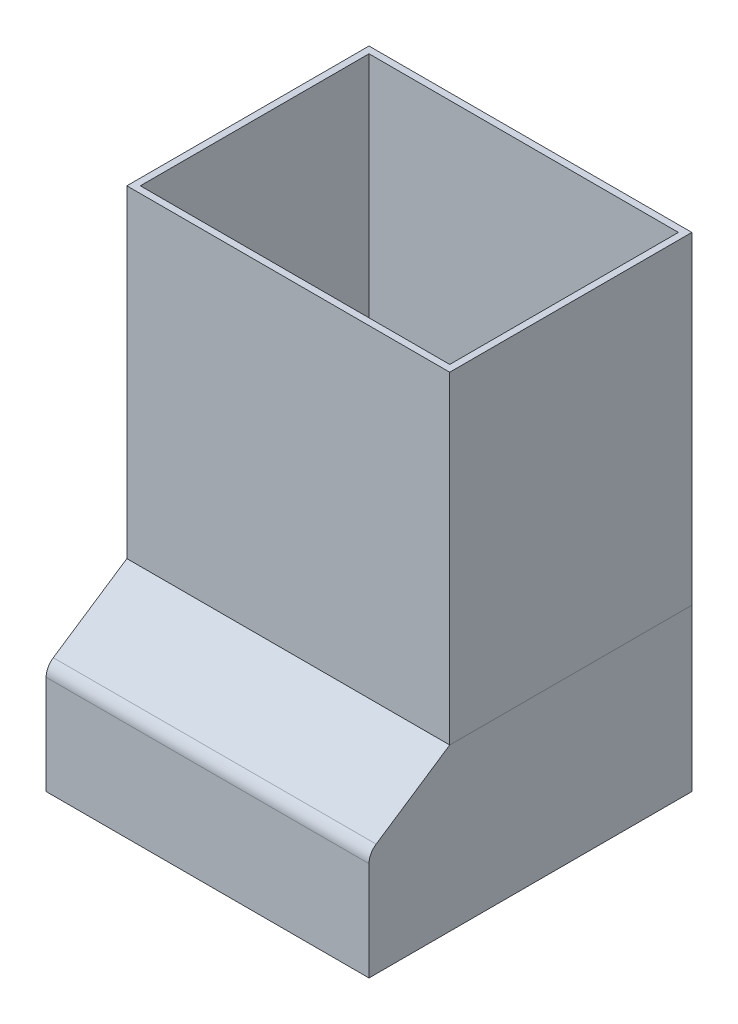
ISO-10303-21;
HEADER;
FILE_DESCRIPTION(('STEP AP214'),'2;1');
FILE_NAME('part.step','',(''),(''),'','','');
FILE_SCHEMA(('AUTOMOTIVE_DESIGN { 1 0 10303 214 1 1 1 1 }'));
ENDSEC;
DATA;
#1=APPLICATION_CONTEXT('core data for automotive mechanical design processes');
#2=APPLICATION_PROTOCOL_DEFINITION('international standard','automotive_design',2000,#1);
#3=PRODUCT_CONTEXT('',#1,'mechanical');
#4=PRODUCT('Part','Part','',(#3));
#5=PRODUCT_RELATED_PRODUCT_CATEGORY('part','',(#4));
#6=PRODUCT_DEFINITION_FORMATION('','',#4);
#7=PRODUCT_DEFINITION_CONTEXT('part definition',#1,'design');
#8=PRODUCT_DEFINITION('design','',#6,#7);
#9=PRODUCT_DEFINITION_SHAPE('','',#8);
#10=(LENGTH_UNIT() NAMED_UNIT(*) SI_UNIT(.MILLI.,.METRE.));
#11=(NAMED_UNIT(*) PLANE_ANGLE_UNIT() SI_UNIT($,.RADIAN.));
#12=(NAMED_UNIT(*) SI_UNIT($,.STERADIAN.) SOLID_ANGLE_UNIT());
#13=UNCERTAINTY_MEASURE_WITH_UNIT(LENGTH_MEASURE(1.E-05),#10,'distance_accuracy_value','');
#14=(GEOMETRIC_REPRESENTATION_CONTEXT(3) GLOBAL_UNCERTAINTY_ASSIGNED_CONTEXT((#13)) GLOBAL_UNIT_ASSIGNED_CONTEXT((#10,
#11,#12)) REPRESENTATION_CONTEXT('',''));
#15=CARTESIAN_POINT('',(0.,0.,0.));
#16=DIRECTION('',(0.,0.,1.));
#17=DIRECTION('',(1.,0.,0.));
#18=AXIS2_PLACEMENT_3D('',#15,#16,#17);
#19=CARTESIAN_POINT('',(0.,469.9,0.));
#20=DIRECTION('',(0.,-1.,0.));
#21=DIRECTION('',(0.,0.,-1.));
#22=AXIS2_PLACEMENT_3D('',#19,#20,#21);
#23=PLANE('',#22);
#24=DIRECTION('',(0.,0.,-1.));
#25=VECTOR('',#24,1.);
#26=CARTESIAN_POINT('',(-177.8,469.9,0.));
#27=LINE('',#26,#25);
#28=CARTESIAN_POINT('',(-177.8,469.9,139.7));
#29=VERTEX_POINT('',#28);
#30=CARTESIAN_POINT('',(-177.8,469.9,50.8));
#31=VERTEX_POINT('',#30);
#32=EDGE_CURVE('E177',#29,#31,#27,.T.);
#33=ORIENTED_EDGE('',*,*,#32,.F.);
#34=DIRECTION('',(1.,0.,0.));
#35=VECTOR('',#34,1.);
#36=CARTESIAN_POINT('',(-165.1,469.9,139.7));
#37=LINE('',#36,#35);
#38=CARTESIAN_POINT('',(-165.1,469.9,139.7));
#39=VERTEX_POINT('',#38);
#40=EDGE_CURVE('E193',#29,#39,#37,.T.);
#41=ORIENTED_EDGE('',*,*,#40,.T.);
#42=DIRECTION('',(0.,0.,-1.));
#43=VECTOR('',#42,1.);
#44=CARTESIAN_POINT('',(-165.1,469.9,38.1));
#45=LINE('',#44,#43);
#46=CARTESIAN_POINT('',(-165.1,469.9,38.1));
#47=VERTEX_POINT('',#46);
#48=EDGE_CURVE('E196',#39,#47,#45,.T.);
#49=ORIENTED_EDGE('',*,*,#48,.T.);
#50=DIRECTION('',(-1.,0.,0.));
#51=VECTOR('',#50,1.);
#52=CARTESIAN_POINT('',(-292.1,469.9,38.1));
#53=LINE('',#52,#51);
#54=CARTESIAN_POINT('',(-292.1,469.9,38.1));
#55=VERTEX_POINT('',#54);
#56=EDGE_CURVE('E198',#47,#55,#53,.T.);
#57=ORIENTED_EDGE('',*,*,#56,.T.);
#58=DIRECTION('',(0.,0.,1.));
#59=VECTOR('',#58,1.);
#60=CARTESIAN_POINT('',(-292.1,469.9,139.7));
#61=LINE('',#60,#59);
#62=CARTESIAN_POINT('',(-292.1,469.9,50.8));
#63=VERTEX_POINT('',#62);
#64=EDGE_CURVE('E190',#55,#63,#61,.T.);
#65=ORIENTED_EDGE('',*,*,#64,.T.);
#66=DIRECTION('',(-1.,0.,0.));
#67=VECTOR('',#66,1.);
#68=CARTESIAN_POINT('',(0.,469.9,50.8));
#69=LINE('',#68,#67);
#70=EDGE_CURVE('E71',#31,#63,#69,.T.);
#71=ORIENTED_EDGE('',*,*,#70,.F.);
#72=EDGE_LOOP('',(#33,#41,#49,#57,#65,#71));
#73=FACE_BOUND('',#72,.T.);
#74=ADVANCED_FACE('F48',(#73),#23,.F.);
#75=CARTESIAN_POINT('',(-292.1,914.4,-304.8));
#76=DIRECTION('',(1.,0.,0.));
#77=DIRECTION('',(0.,0.,-1.));
#78=AXIS2_PLACEMENT_3D('',#75,#76,#77);
#79=PLANE('',#78);
#80=ORIENTED_EDGE('',*,*,#64,.F.);
#81=DIRECTION('',(0.,-1.,0.));
#82=VECTOR('',#81,1.);
#83=CARTESIAN_POINT('',(-292.1,469.9,38.1));
#84=LINE('',#83,#82);
#85=CARTESIAN_POINT('',(-292.1,317.5,38.1));
#86=VERTEX_POINT('',#85);
#87=EDGE_CURVE('E200',#55,#86,#84,.T.);
#88=ORIENTED_EDGE('',*,*,#87,.T.);
#89=DIRECTION('',(0.,0.,1.));
#90=VECTOR('',#89,1.);
#91=CARTESIAN_POINT('',(-292.1,317.5,-304.8));
#92=LINE('',#91,#90);
#93=CARTESIAN_POINT('',(-292.1,317.5,-292.1));
#94=VERTEX_POINT('',#93);
#95=EDGE_CURVE('E213',#94,#86,#92,.T.);
#96=ORIENTED_EDGE('',*,*,#95,.F.);
#97=DIRECTION('',(0.,-1.,0.));
#98=VECTOR('',#97,1.);
#99=CARTESIAN_POINT('',(-292.1,914.4,-292.1));
#100=LINE('',#99,#98);
#101=CARTESIAN_POINT('',(-292.1,914.4,-292.1));
#102=VERTEX_POINT('',#101);
#103=EDGE_CURVE('E162',#102,#94,#100,.T.);
#104=ORIENTED_EDGE('',*,*,#103,.F.);
#105=DIRECTION('',(0.,0.,1.));
#106=VECTOR('',#105,1.);
#107=CARTESIAN_POINT('',(-292.1,914.4,-304.8));
#108=LINE('',#107,#106);
#109=CARTESIAN_POINT('',(-292.1,914.4,139.7));
#110=VERTEX_POINT('',#109);
#111=EDGE_CURVE('E159',#102,#110,#108,.T.);
#112=ORIENTED_EDGE('',*,*,#111,.T.);
#113=DIRECTION('',(0.,-1.,0.));
#114=VECTOR('',#113,1.);
#115=CARTESIAN_POINT('',(-292.1,914.4,139.7));
#116=LINE('',#115,#114);
#117=CARTESIAN_POINT('',(-292.1,304.8,139.7));
#118=VERTEX_POINT('',#117);
#119=EDGE_CURVE('E151',#110,#118,#116,.T.);
#120=ORIENTED_EDGE('',*,*,#119,.T.);
#121=DIRECTION('',(0.,0.,1.));
#122=VECTOR('',#121,1.);
#123=CARTESIAN_POINT('',(-292.1,304.8,0.));
#124=LINE('',#123,#122);
#125=CARTESIAN_POINT('',(-292.1,304.8,50.8));
#126=VERTEX_POINT('',#125);
#127=EDGE_CURVE('E155',#126,#118,#124,.T.);
#128=ORIENTED_EDGE('',*,*,#127,.F.);
#129=DIRECTION('',(0.,-1.,0.));
#130=VECTOR('',#129,1.);
#131=CARTESIAN_POINT('',(-292.1,914.4,50.8));
#132=LINE('',#131,#130);
#133=EDGE_CURVE('E184',#63,#126,#132,.T.);
#134=ORIENTED_EDGE('',*,*,#133,.F.);
#135=EDGE_LOOP('',(#80,#88,#96,#104,#112,#120,#128,#134));
#136=FACE_BOUND('',#135,.T.);
#137=ADVANCED_FACE('F153',(#136),#79,.T.);
#138=CARTESIAN_POINT('',(-304.8,914.4,139.7));
#139=DIRECTION('',(0.,0.,-1.));
#140=DIRECTION('',(-1.,0.,0.));
#141=AXIS2_PLACEMENT_3D('',#138,#139,#140);
#142=PLANE('',#141);
#143=DIRECTION('',(1.,0.,0.));
#144=VECTOR('',#143,1.);
#145=CARTESIAN_POINT('',(-304.8,317.5,139.7));
#146=LINE('',#145,#144);
#147=CARTESIAN_POINT('',(-165.1,317.5,139.7));
#148=VERTEX_POINT('',#147);
#149=CARTESIAN_POINT('',(292.1,317.5,139.7));
#150=VERTEX_POINT('',#149);
#151=EDGE_CURVE('E222',#148,#150,#146,.T.);
#152=ORIENTED_EDGE('',*,*,#151,.F.);
#153=DIRECTION('',(0.,-1.,0.));
#154=VECTOR('',#153,1.);
#155=CARTESIAN_POINT('',(-165.1,469.9,139.7));
#156=LINE('',#155,#154);
#157=EDGE_CURVE('E208',#39,#148,#156,.T.);
#158=ORIENTED_EDGE('',*,*,#157,.F.);
#159=ORIENTED_EDGE('',*,*,#40,.F.);
#160=DIRECTION('',(0.,1.,0.));
#161=VECTOR('',#160,1.);
#162=CARTESIAN_POINT('',(-177.8,914.4,139.7));
#163=LINE('',#162,#161);
#164=CARTESIAN_POINT('',(-177.8,304.8,139.7));
#165=VERTEX_POINT('',#164);
#166=EDGE_CURVE('E63',#165,#29,#163,.T.);
#167=ORIENTED_EDGE('',*,*,#166,.F.);
#168=DIRECTION('',(1.,0.,0.));
#169=VECTOR('',#168,1.);
#170=CARTESIAN_POINT('',(0.,304.8,139.7));
#171=LINE('',#170,#169);
#172=EDGE_CURVE('E166',#118,#165,#171,.T.);
#173=ORIENTED_EDGE('',*,*,#172,.F.);
#174=ORIENTED_EDGE('',*,*,#119,.F.);
#175=DIRECTION('',(1.,0.,0.));
#176=VECTOR('',#175,1.);
#177=CARTESIAN_POINT('',(-304.8,914.4,139.7));
#178=LINE('',#177,#176);
#179=CARTESIAN_POINT('',(292.1,914.4,139.7));
#180=VERTEX_POINT('',#179);
#181=EDGE_CURVE('E232',#110,#180,#178,.T.);
#182=ORIENTED_EDGE('',*,*,#181,.T.);
#183=DIRECTION('',(0.,-1.,0.));
#184=VECTOR('',#183,1.);
#185=CARTESIAN_POINT('',(292.1,914.4,139.7));
#186=LINE('',#185,#184);
#187=EDGE_CURVE('E163',#180,#150,#186,.T.);
#188=ORIENTED_EDGE('',*,*,#187,.T.);
#189=EDGE_LOOP('',(#152,#158,#159,#167,#173,#174,#182,#188));
#190=FACE_BOUND('',#189,.T.);
#191=ADVANCED_FACE('F168',(#190),#142,.T.);
#192=CARTESIAN_POINT('',(0.,317.5,0.));
#193=DIRECTION('',(0.,1.,0.));
#194=DIRECTION('',(0.,0.,1.));
#195=AXIS2_PLACEMENT_3D('',#192,#193,#194);
#196=PLANE('',#195);
#197=DIRECTION('',(-1.,0.,0.));
#198=VECTOR('',#197,1.);
#199=CARTESIAN_POINT('',(-292.1,317.5,38.1));
#200=LINE('',#199,#198);
#201=CARTESIAN_POINT('',(-165.1,317.5,38.1));
#202=VERTEX_POINT('',#201);
#203=EDGE_CURVE('E194',#202,#86,#200,.T.);
#204=ORIENTED_EDGE('',*,*,#203,.F.);
#205=DIRECTION('',(0.,0.,-1.));
#206=VECTOR('',#205,1.);
#207=CARTESIAN_POINT('',(-165.1,317.5,38.1));
#208=LINE('',#207,#206);
#209=EDGE_CURVE('E189',#148,#202,#208,.T.);
#210=ORIENTED_EDGE('',*,*,#209,.F.);
#211=ORIENTED_EDGE('',*,*,#151,.T.);
#212=DIRECTION('',(0.,0.,-1.));
#213=VECTOR('',#212,1.);
#214=CARTESIAN_POINT('',(292.1,317.5,152.4));
#215=LINE('',#214,#213);
#216=CARTESIAN_POINT('',(292.1,317.5,-292.1));
#217=VERTEX_POINT('',#216);
#218=EDGE_CURVE('E225',#150,#217,#215,.T.);
#219=ORIENTED_EDGE('',*,*,#218,.T.);
#220=DIRECTION('',(-1.,0.,0.));
#221=VECTOR('',#220,1.);
#222=CARTESIAN_POINT('',(304.8,317.5,-292.1));
#223=LINE('',#222,#221);
#224=EDGE_CURVE('E210',#217,#94,#223,.T.);
#225=ORIENTED_EDGE('',*,*,#224,.T.);
#226=ORIENTED_EDGE('',*,*,#95,.T.);
#227=EDGE_LOOP('',(#204,#210,#211,#219,#225,#226));
#228=FACE_BOUND('',#227,.T.);
#229=ADVANCED_FACE('F283',(#228),#196,.T.);
#230=CARTESIAN_POINT('',(304.8,914.4,-304.8));
#231=DIRECTION('',(0.,0.,1.));
#232=DIRECTION('',(1.,0.,0.));
#233=AXIS2_PLACEMENT_3D('',#230,#231,#232);
#234=PLANE('',#233);
#235=DIRECTION('',(-1.,0.,0.));
#236=VECTOR('',#235,1.);
#237=CARTESIAN_POINT('',(304.8,304.8,-304.8));
#238=LINE('',#237,#236);
#239=CARTESIAN_POINT('',(304.8,304.8,-304.8));
#240=VERTEX_POINT('',#239);
#241=CARTESIAN_POINT('',(-304.8,304.8,-304.8));
#242=VERTEX_POINT('',#241);
#243=EDGE_CURVE('E216',#240,#242,#238,.T.);
#244=ORIENTED_EDGE('',*,*,#243,.T.);
#245=DIRECTION('',(0.,-1.,0.));
#246=VECTOR('',#245,1.);
#247=CARTESIAN_POINT('',(-304.8,914.4,-304.8));
#248=LINE('',#247,#246);
#249=CARTESIAN_POINT('',(-304.8,914.4,-304.8));
#250=VERTEX_POINT('',#249);
#251=EDGE_CURVE('E12',#250,#242,#248,.T.);
#252=ORIENTED_EDGE('',*,*,#251,.F.);
#253=DIRECTION('',(-1.,0.,0.));
#254=VECTOR('',#253,1.);
#255=CARTESIAN_POINT('',(304.8,914.4,-304.8));
#256=LINE('',#255,#254);
#257=CARTESIAN_POINT('',(304.8,914.4,-304.8));
#258=VERTEX_POINT('',#257);
#259=EDGE_CURVE('E235',#258,#250,#256,.T.);
#260=ORIENTED_EDGE('',*,*,#259,.F.);
#261=DIRECTION('',(0.,-1.,0.));
#262=VECTOR('',#261,1.);
#263=CARTESIAN_POINT('',(304.8,914.4,-304.8));
#264=LINE('',#263,#262);
#265=EDGE_CURVE('E245',#258,#240,#264,.T.);
#266=ORIENTED_EDGE('',*,*,#265,.T.);
#267=EDGE_LOOP('',(#244,#252,#260,#266));
#268=FACE_BOUND('',#267,.T.);
#269=ADVANCED_FACE('F50',(#268),#234,.F.);
#270=CARTESIAN_POINT('',(-304.8,914.4,-304.8));
#271=DIRECTION('',(1.,0.,0.));
#272=DIRECTION('',(0.,0.,-1.));
#273=AXIS2_PLACEMENT_3D('',#270,#271,#272);
#274=PLANE('',#273);
#275=DIRECTION('',(0.,0.,1.));
#276=VECTOR('',#275,1.);
#277=CARTESIAN_POINT('',(-304.8,304.8,-304.8));
#278=LINE('',#277,#276);
#279=CARTESIAN_POINT('',(-304.8,304.8,152.4));
#280=VERTEX_POINT('',#279);
#281=EDGE_CURVE('E248',#242,#280,#278,.T.);
#282=ORIENTED_EDGE('',*,*,#281,.T.);
#283=DIRECTION('',(0.,-1.,0.));
#284=VECTOR('',#283,1.);
#285=CARTESIAN_POINT('',(-304.8,914.4,152.4));
#286=LINE('',#285,#284);
#287=CARTESIAN_POINT('',(-304.8,914.4,152.4));
#288=VERTEX_POINT('',#287);
#289=EDGE_CURVE('E56',#288,#280,#286,.T.);
#290=ORIENTED_EDGE('',*,*,#289,.F.);
#291=DIRECTION('',(0.,0.,1.));
#292=VECTOR('',#291,1.);
#293=CARTESIAN_POINT('',(-304.8,914.4,-304.8));
#294=LINE('',#293,#292);
#295=EDGE_CURVE('E238',#250,#288,#294,.T.);
#296=ORIENTED_EDGE('',*,*,#295,.F.);
#297=ORIENTED_EDGE('',*,*,#251,.T.);
#298=EDGE_LOOP('',(#282,#290,#296,#297));
#299=FACE_BOUND('',#298,.T.);
#300=ADVANCED_FACE('F276',(#299),#274,.F.);
#301=CARTESIAN_POINT('',(-304.8,914.4,152.4));
#302=DIRECTION('',(0.,0.,-1.));
#303=DIRECTION('',(-1.,0.,0.));
#304=AXIS2_PLACEMENT_3D('',#301,#302,#303);
#305=PLANE('',#304);
#306=DIRECTION('',(1.,0.,0.));
#307=VECTOR('',#306,1.);
#308=CARTESIAN_POINT('',(-304.8,304.8,152.4));
#309=LINE('',#308,#307);
#310=CARTESIAN_POINT('',(304.8,304.8,152.4));
#311=VERTEX_POINT('',#310);
#312=EDGE_CURVE('E250',#280,#311,#309,.T.);
#313=ORIENTED_EDGE('',*,*,#312,.T.);
#314=DIRECTION('',(0.,-1.,0.));
#315=VECTOR('',#314,1.);
#316=CARTESIAN_POINT('',(304.8,914.4,152.4));
#317=LINE('',#316,#315);
#318=CARTESIAN_POINT('',(304.8,914.4,152.4));
#319=VERTEX_POINT('',#318);
#320=EDGE_CURVE('E255',#319,#311,#317,.T.);
#321=ORIENTED_EDGE('',*,*,#320,.F.);
#322=DIRECTION('',(1.,0.,0.));
#323=VECTOR('',#322,1.);
#324=CARTESIAN_POINT('',(-304.8,914.4,152.4));
#325=LINE('',#324,#323);
#326=EDGE_CURVE('E241',#288,#319,#325,.T.);
#327=ORIENTED_EDGE('',*,*,#326,.F.);
#328=ORIENTED_EDGE('',*,*,#289,.T.);
#329=EDGE_LOOP('',(#313,#321,#327,#328));
#330=FACE_BOUND('',#329,.T.);
#331=ADVANCED_FACE('F262',(#330),#305,.F.);
#332=CARTESIAN_POINT('',(304.8,914.4,152.4));
#333=DIRECTION('',(-1.,0.,0.));
#334=DIRECTION('',(0.,0.,1.));
#335=AXIS2_PLACEMENT_3D('',#332,#333,#334);
#336=PLANE('',#335);
#337=DIRECTION('',(0.,0.,-1.));
#338=VECTOR('',#337,1.);
#339=CARTESIAN_POINT('',(304.8,304.8,152.4));
#340=LINE('',#339,#338);
#341=EDGE_CURVE('E239',#311,#240,#340,.T.);
#342=ORIENTED_EDGE('',*,*,#341,.T.);
#343=ORIENTED_EDGE('',*,*,#265,.F.);
#344=DIRECTION('',(0.,0.,-1.));
#345=VECTOR('',#344,1.);
#346=CARTESIAN_POINT('',(304.8,914.4,152.4));
#347=LINE('',#346,#345);
#348=EDGE_CURVE('E243',#319,#258,#347,.T.);
#349=ORIENTED_EDGE('',*,*,#348,.F.);
#350=ORIENTED_EDGE('',*,*,#320,.T.);
#351=EDGE_LOOP('',(#342,#343,#349,#350));
#352=FACE_BOUND('',#351,.T.);
#353=ADVANCED_FACE('F269',(#352),#336,.F.);
#354=CARTESIAN_POINT('',(0.,914.4,0.));
#355=DIRECTION('',(0.,1.,0.));
#356=DIRECTION('',(0.,0.,1.));
#357=AXIS2_PLACEMENT_3D('',#354,#355,#356);
#358=PLANE('',#357);
#359=DIRECTION('',(-1.,0.,0.));
#360=VECTOR('',#359,1.);
#361=CARTESIAN_POINT('',(304.8,914.4,-292.1));
#362=LINE('',#361,#360);
#363=CARTESIAN_POINT('',(292.1,914.4,-292.1));
#364=VERTEX_POINT('',#363);
#365=EDGE_CURVE('E229',#364,#102,#362,.T.);
#366=ORIENTED_EDGE('',*,*,#365,.F.);
#367=DIRECTION('',(0.,0.,-1.));
#368=VECTOR('',#367,1.);
#369=CARTESIAN_POINT('',(292.1,914.4,152.4));
#370=LINE('',#369,#368);
#371=EDGE_CURVE('E220',#180,#364,#370,.T.);
#372=ORIENTED_EDGE('',*,*,#371,.F.);
#373=ORIENTED_EDGE('',*,*,#181,.F.);
#374=ORIENTED_EDGE('',*,*,#111,.F.);
#375=EDGE_LOOP('',(#366,#372,#373,#374));
#376=FACE_BOUND('',#375,.T.);
#377=ORIENTED_EDGE('',*,*,#259,.T.);
#378=ORIENTED_EDGE('',*,*,#295,.T.);
#379=ORIENTED_EDGE('',*,*,#326,.T.);
#380=ORIENTED_EDGE('',*,*,#348,.T.);
#381=EDGE_LOOP('',(#377,#378,#379,#380));
#382=FACE_BOUND('',#381,.T.);
#383=ADVANCED_FACE('F275',(#376,#382),#358,.T.);
#384=CARTESIAN_POINT('',(0.,304.8,0.));
#385=DIRECTION('',(0.,1.,0.));
#386=DIRECTION('',(0.,0.,1.));
#387=AXIS2_PLACEMENT_3D('',#384,#385,#386);
#388=PLANE('',#387);
#389=DIRECTION('',(-1.,0.,0.));
#390=VECTOR('',#389,1.);
#391=CARTESIAN_POINT('',(0.,304.8,50.8));
#392=LINE('',#391,#390);
#393=CARTESIAN_POINT('',(-177.8,304.8,50.8));
#394=VERTEX_POINT('',#393);
#395=EDGE_CURVE('E176',#394,#126,#392,.T.);
#396=ORIENTED_EDGE('',*,*,#395,.T.);
#397=ORIENTED_EDGE('',*,*,#127,.T.);
#398=ORIENTED_EDGE('',*,*,#172,.T.);
#399=DIRECTION('',(0.,0.,-1.));
#400=VECTOR('',#399,1.);
#401=CARTESIAN_POINT('',(-177.8,304.8,0.));
#402=LINE('',#401,#400);
#403=EDGE_CURVE('E171',#165,#394,#402,.T.);
#404=ORIENTED_EDGE('',*,*,#403,.T.);
#405=EDGE_LOOP('',(#396,#397,#398,#404));
#406=FACE_BOUND('',#405,.T.);
#407=ORIENTED_EDGE('',*,*,#243,.F.);
#408=ORIENTED_EDGE('',*,*,#341,.F.);
#409=ORIENTED_EDGE('',*,*,#312,.F.);
#410=ORIENTED_EDGE('',*,*,#281,.F.);
#411=EDGE_LOOP('',(#407,#408,#409,#410));
#412=FACE_BOUND('',#411,.T.);
#413=ADVANCED_FACE('F173',(#406,#412),#388,.F.);
#414=CARTESIAN_POINT('',(304.8,914.4,-292.1));
#415=DIRECTION('',(0.,0.,1.));
#416=DIRECTION('',(1.,0.,0.));
#417=AXIS2_PLACEMENT_3D('',#414,#415,#416);
#418=PLANE('',#417);
#419=ORIENTED_EDGE('',*,*,#224,.F.);
#420=DIRECTION('',(0.,-1.,0.));
#421=VECTOR('',#420,1.);
#422=CARTESIAN_POINT('',(292.1,914.4,-292.1));
#423=LINE('',#422,#421);
#424=EDGE_CURVE('E217',#364,#217,#423,.T.);
#425=ORIENTED_EDGE('',*,*,#424,.F.);
#426=ORIENTED_EDGE('',*,*,#365,.T.);
#427=ORIENTED_EDGE('',*,*,#103,.T.);
#428=EDGE_LOOP('',(#419,#425,#426,#427));
#429=FACE_BOUND('',#428,.T.);
#430=ADVANCED_FACE('F305',(#429),#418,.T.);
#431=CARTESIAN_POINT('',(292.1,914.4,152.4));
#432=DIRECTION('',(-1.,0.,0.));
#433=DIRECTION('',(0.,0.,1.));
#434=AXIS2_PLACEMENT_3D('',#431,#432,#433);
#435=PLANE('',#434);
#436=ORIENTED_EDGE('',*,*,#218,.F.);
#437=ORIENTED_EDGE('',*,*,#187,.F.);
#438=ORIENTED_EDGE('',*,*,#371,.T.);
#439=ORIENTED_EDGE('',*,*,#424,.T.);
#440=EDGE_LOOP('',(#436,#437,#438,#439));
#441=FACE_BOUND('',#440,.T.);
#442=ADVANCED_FACE('F303',(#441),#435,.T.);
#443=CARTESIAN_POINT('',(-165.1,469.9,38.1));
#444=DIRECTION('',(-1.,0.,0.));
#445=DIRECTION('',(0.,0.,1.));
#446=AXIS2_PLACEMENT_3D('',#443,#444,#445);
#447=PLANE('',#446);
#448=ORIENTED_EDGE('',*,*,#209,.T.);
#449=DIRECTION('',(0.,-1.,0.));
#450=VECTOR('',#449,1.);
#451=CARTESIAN_POINT('',(-165.1,469.9,38.1));
#452=LINE('',#451,#450);
#453=EDGE_CURVE('E206',#47,#202,#452,.T.);
#454=ORIENTED_EDGE('',*,*,#453,.F.);
#455=ORIENTED_EDGE('',*,*,#48,.F.);
#456=ORIENTED_EDGE('',*,*,#157,.T.);
#457=EDGE_LOOP('',(#448,#454,#455,#456));
#458=FACE_BOUND('',#457,.T.);
#459=ADVANCED_FACE('F299',(#458),#447,.F.);
#460=CARTESIAN_POINT('',(-292.1,469.9,38.1));
#461=DIRECTION('',(0.,0.,1.));
#462=DIRECTION('',(1.,0.,0.));
#463=AXIS2_PLACEMENT_3D('',#460,#461,#462);
#464=PLANE('',#463);
#465=ORIENTED_EDGE('',*,*,#203,.T.);
#466=ORIENTED_EDGE('',*,*,#87,.F.);
#467=ORIENTED_EDGE('',*,*,#56,.F.);
#468=ORIENTED_EDGE('',*,*,#453,.T.);
#469=EDGE_LOOP('',(#465,#466,#467,#468));
#470=FACE_BOUND('',#469,.T.);
#471=ADVANCED_FACE('F297',(#470),#464,.F.);
#472=CARTESIAN_POINT('',(-292.1,469.9,50.8));
#473=DIRECTION('',(0.,0.,1.));
#474=DIRECTION('',(1.,0.,0.));
#475=AXIS2_PLACEMENT_3D('',#472,#473,#474);
#476=PLANE('',#475);
#477=DIRECTION('',(0.,-1.,0.));
#478=VECTOR('',#477,1.);
#479=CARTESIAN_POINT('',(-177.8,469.9,50.8));
#480=LINE('',#479,#478);
#481=EDGE_CURVE('E183',#31,#394,#480,.T.);
#482=ORIENTED_EDGE('',*,*,#481,.F.);
#483=ORIENTED_EDGE('',*,*,#70,.T.);
#484=ORIENTED_EDGE('',*,*,#133,.T.);
#485=ORIENTED_EDGE('',*,*,#395,.F.);
#486=EDGE_LOOP('',(#482,#483,#484,#485));
#487=FACE_BOUND('',#486,.T.);
#488=ADVANCED_FACE('F295',(#487),#476,.T.);
#489=CARTESIAN_POINT('',(-177.8,469.9,38.1));
#490=DIRECTION('',(-1.,0.,0.));
#491=DIRECTION('',(0.,0.,1.));
#492=AXIS2_PLACEMENT_3D('',#489,#490,#491);
#493=PLANE('',#492);
#494=ORIENTED_EDGE('',*,*,#166,.T.);
#495=ORIENTED_EDGE('',*,*,#32,.T.);
#496=ORIENTED_EDGE('',*,*,#481,.T.);
#497=ORIENTED_EDGE('',*,*,#403,.F.);
#498=EDGE_LOOP('',(#494,#495,#496,#497));
#499=FACE_BOUND('',#498,.T.);
#500=ADVANCED_FACE('F363',(#499),#493,.T.);
#501=CLOSED_SHELL('',(#74,#137,#191,#229,#269,#300,#331,#353,#383,#413,#430,#442,#459,#471,#488,#500));
#502=MANIFOLD_SOLID_BREP('B2',#501);
#503=CARTESIAN_POINT('',(-304.8,304.8,292.1));
#504=DIRECTION('',(0.,0.,-1.));
#505=DIRECTION('',(-1.,0.,0.));
#506=AXIS2_PLACEMENT_3D('',#503,#504,#505);
#507=PLANE('',#506);
#508=DIRECTION('',(-1.,0.,0.));
#509=VECTOR('',#508,1.);
#510=CARTESIAN_POINT('',(1447.8,196.403166267202,292.1));
#511=LINE('',#510,#509);
#512=CARTESIAN_POINT('',(292.1,196.403166267202,292.1));
#513=VERTEX_POINT('',#512);
#514=CARTESIAN_POINT('',(-292.1,196.403166267202,292.1));
#515=VERTEX_POINT('',#514);
#516=EDGE_CURVE('E620',#513,#515,#511,.T.);
#517=ORIENTED_EDGE('',*,*,#516,.F.);
#518=DIRECTION('',(0.,-1.,0.));
#519=VECTOR('',#518,1.);
#520=CARTESIAN_POINT('',(292.1,304.8,292.1));
#521=LINE('',#520,#519);
#522=CARTESIAN_POINT('',(292.1,12.7,292.1));
#523=VERTEX_POINT('',#522);
#524=EDGE_CURVE('E606',#513,#523,#521,.T.);
#525=ORIENTED_EDGE('',*,*,#524,.T.);
#526=DIRECTION('',(1.,0.,0.));
#527=VECTOR('',#526,1.);
#528=CARTESIAN_POINT('',(0.,12.7,292.1));
#529=LINE('',#528,#527);
#530=CARTESIAN_POINT('',(-292.1,12.7,292.1));
#531=VERTEX_POINT('',#530);
#532=EDGE_CURVE('E615',#531,#523,#529,.T.);
#533=ORIENTED_EDGE('',*,*,#532,.F.);
#534=DIRECTION('',(0.,-1.,0.));
#535=VECTOR('',#534,1.);
#536=CARTESIAN_POINT('',(-292.1,304.8,292.1));
#537=LINE('',#536,#535);
#538=EDGE_CURVE('E618',#515,#531,#537,.T.);
#539=ORIENTED_EDGE('',*,*,#538,.F.);
#540=EDGE_LOOP('',(#517,#525,#533,#539));
#541=FACE_BOUND('',#540,.T.);
#542=ADVANCED_FACE('F471',(#541),#507,.T.);
#543=CARTESIAN_POINT('',(292.1,304.8,-304.8));
#544=DIRECTION('',(1.,0.,0.));
#545=DIRECTION('',(0.,0.,-1.));
#546=AXIS2_PLACEMENT_3D('',#543,#544,#545);
#547=PLANE('',#546);
#548=DIRECTION('',(0.,0.,1.));
#549=VECTOR('',#548,1.);
#550=CARTESIAN_POINT('',(292.1,292.1,0.));
#551=LINE('',#550,#549);
#552=CARTESIAN_POINT('',(292.1,292.1,-292.1));
#553=VERTEX_POINT('',#552);
#554=CARTESIAN_POINT('',(292.1,292.1,148.554749400804));
#555=VERTEX_POINT('',#554);
#556=EDGE_CURVE('E609',#553,#555,#551,.T.);
#557=ORIENTED_EDGE('',*,*,#556,.F.);
#558=DIRECTION('',(0.,-1.,0.));
#559=VECTOR('',#558,1.);
#560=CARTESIAN_POINT('',(292.1,304.8,-292.1));
#561=LINE('',#560,#559);
#562=CARTESIAN_POINT('',(292.1,12.7,-292.1));
#563=VERTEX_POINT('',#562);
#564=EDGE_CURVE('E670',#553,#563,#561,.T.);
#565=ORIENTED_EDGE('',*,*,#564,.T.);
#566=DIRECTION('',(0.,0.,1.));
#567=VECTOR('',#566,1.);
#568=CARTESIAN_POINT('',(292.1,12.7,0.));
#569=LINE('',#568,#567);
#570=EDGE_CURVE('E658',#563,#523,#569,.T.);
#571=ORIENTED_EDGE('',*,*,#570,.T.);
#572=ORIENTED_EDGE('',*,*,#524,.F.);
#573=DIRECTION('',(0.,0.554700196225229,-0.832050294337844));
#574=VECTOR('',#573,1.);
#575=CARTESIAN_POINT('',(292.1,192.632961261909,297.75530750794));
#576=LINE('',#575,#574);
#577=EDGE_CURVE('E655',#513,#555,#576,.T.);
#578=ORIENTED_EDGE('',*,*,#577,.T.);
#579=EDGE_LOOP('',(#557,#565,#571,#572,#578));
#580=FACE_BOUND('',#579,.T.);
#581=ADVANCED_FACE('F681',(#580),#547,.F.);
#582=CARTESIAN_POINT('',(0.,292.1,0.));
#583=DIRECTION('',(0.,-1.,0.));
#584=DIRECTION('',(0.,0.,-1.));
#585=AXIS2_PLACEMENT_3D('',#582,#583,#584);
#586=PLANE('',#585);
#587=DIRECTION('',(1.,0.,0.));
#588=VECTOR('',#587,1.);
#589=CARTESIAN_POINT('',(0.,292.1,50.8));
#590=LINE('',#589,#588);
#591=CARTESIAN_POINT('',(-292.1,292.1,50.8));
#592=VERTEX_POINT('',#591);
#593=CARTESIAN_POINT('',(-177.8,292.1,50.8));
#594=VERTEX_POINT('',#593);
#595=EDGE_CURVE('E884',#592,#594,#590,.T.);
#596=ORIENTED_EDGE('',*,*,#595,.F.);
#597=DIRECTION('',(0.,0.,1.));
#598=VECTOR('',#597,1.);
#599=CARTESIAN_POINT('',(-292.1,292.1,0.));
#600=LINE('',#599,#598);
#601=CARTESIAN_POINT('',(-292.1,292.1,-292.1));
#602=VERTEX_POINT('',#601);
#603=EDGE_CURVE('E605',#602,#592,#600,.T.);
#604=ORIENTED_EDGE('',*,*,#603,.F.);
#605=DIRECTION('',(1.,0.,0.));
#606=VECTOR('',#605,1.);
#607=CARTESIAN_POINT('',(0.,292.1,-292.1));
#608=LINE('',#607,#606);
#609=EDGE_CURVE('E608',#602,#553,#608,.T.);
#610=ORIENTED_EDGE('',*,*,#609,.T.);
#611=ORIENTED_EDGE('',*,*,#556,.T.);
#612=DIRECTION('',(-1.,0.,0.));
#613=VECTOR('',#612,1.);
#614=CARTESIAN_POINT('',(0.,292.1,148.554749400804));
#615=LINE('',#614,#613);
#616=CARTESIAN_POINT('',(-292.1,292.1,148.554749400804));
#617=VERTEX_POINT('',#616);
#618=EDGE_CURVE('E604',#555,#617,#615,.T.);
#619=ORIENTED_EDGE('',*,*,#618,.T.);
#620=CARTESIAN_POINT('',(-292.1,292.1,139.7));
#621=VERTEX_POINT('',#620);
#622=EDGE_CURVE('E593',#621,#617,#600,.T.);
#623=ORIENTED_EDGE('',*,*,#622,.F.);
#624=DIRECTION('',(-1.,0.,0.));
#625=VECTOR('',#624,1.);
#626=CARTESIAN_POINT('',(0.,292.1,139.7));
#627=LINE('',#626,#625);
#628=CARTESIAN_POINT('',(-177.8,292.1,139.7));
#629=VERTEX_POINT('',#628);
#630=EDGE_CURVE('E575',#629,#621,#627,.T.);
#631=ORIENTED_EDGE('',*,*,#630,.F.);
#632=DIRECTION('',(0.,0.,1.));
#633=VECTOR('',#632,1.);
#634=CARTESIAN_POINT('',(-177.8,292.1,0.));
#635=LINE('',#634,#633);
#636=EDGE_CURVE('E623',#594,#629,#635,.T.);
#637=ORIENTED_EDGE('',*,*,#636,.F.);
#638=EDGE_LOOP('',(#596,#604,#610,#611,#619,#623,#631,#637));
#639=FACE_BOUND('',#638,.T.);
#640=ADVANCED_FACE('F602',(#639),#586,.T.);
#641=CARTESIAN_POINT('',(-304.8,304.8,-292.1));
#642=DIRECTION('',(0.,0.,-1.));
#643=DIRECTION('',(-1.,0.,0.));
#644=AXIS2_PLACEMENT_3D('',#641,#642,#643);
#645=PLANE('',#644);
#646=DIRECTION('',(1.,0.,0.));
#647=VECTOR('',#646,1.);
#648=CARTESIAN_POINT('',(0.,12.7,-292.1));
#649=LINE('',#648,#647);
#650=CARTESIAN_POINT('',(-292.1,12.7,-292.1));
#651=VERTEX_POINT('',#650);
#652=EDGE_CURVE('E661',#651,#563,#649,.T.);
#653=ORIENTED_EDGE('',*,*,#652,.T.);
#654=ORIENTED_EDGE('',*,*,#564,.F.);
#655=ORIENTED_EDGE('',*,*,#609,.F.);
#656=DIRECTION('',(0.,-1.,0.));
#657=VECTOR('',#656,1.);
#658=CARTESIAN_POINT('',(-292.1,304.8,-292.1));
#659=LINE('',#658,#657);
#660=EDGE_CURVE('E667',#602,#651,#659,.T.);
#661=ORIENTED_EDGE('',*,*,#660,.T.);
#662=EDGE_LOOP('',(#653,#654,#655,#661));
#663=FACE_BOUND('',#662,.T.);
#664=ADVANCED_FACE('F678',(#663),#645,.F.);
#665=CARTESIAN_POINT('',(-292.1,304.8,-304.8));
#666=DIRECTION('',(1.,0.,0.));
#667=DIRECTION('',(0.,0.,-1.));
#668=AXIS2_PLACEMENT_3D('',#665,#666,#667);
#669=PLANE('',#668);
#670=ORIENTED_EDGE('',*,*,#603,.T.);
#671=DIRECTION('',(0.,1.,0.));
#672=VECTOR('',#671,1.);
#673=CARTESIAN_POINT('',(-292.1,79.756,50.8));
#674=LINE('',#673,#672);
#675=CARTESIAN_POINT('',(-292.1,304.8,50.8));
#676=VERTEX_POINT('',#675);
#677=EDGE_CURVE('E587',#592,#676,#674,.T.);
#678=ORIENTED_EDGE('',*,*,#677,.T.);
#679=DIRECTION('',(0.,0.,-1.));
#680=VECTOR('',#679,1.);
#681=CARTESIAN_POINT('',(-292.1,304.8,0.));
#682=LINE('',#681,#680);
#683=CARTESIAN_POINT('',(-292.1,304.8,139.7));
#684=VERTEX_POINT('',#683);
#685=EDGE_CURVE('E597',#684,#676,#682,.T.);
#686=ORIENTED_EDGE('',*,*,#685,.F.);
#687=DIRECTION('',(0.,1.,0.));
#688=VECTOR('',#687,1.);
#689=CARTESIAN_POINT('',(-292.1,79.756,139.7));
#690=LINE('',#689,#688);
#691=EDGE_CURVE('E578',#621,#684,#690,.T.);
#692=ORIENTED_EDGE('',*,*,#691,.F.);
#693=ORIENTED_EDGE('',*,*,#622,.T.);
#694=DIRECTION('',(0.,0.554700196225229,-0.832050294337844));
#695=VECTOR('',#694,1.);
#696=CARTESIAN_POINT('',(-292.1,192.632961261909,297.75530750794));
#697=LINE('',#696,#695);
#698=EDGE_CURVE('E669',#515,#617,#697,.T.);
#699=ORIENTED_EDGE('',*,*,#698,.F.);
#700=ORIENTED_EDGE('',*,*,#538,.T.);
#701=DIRECTION('',(0.,0.,1.));
#702=VECTOR('',#701,1.);
#703=CARTESIAN_POINT('',(-292.1,12.7,0.));
#704=LINE('',#703,#702);
#705=EDGE_CURVE('E664',#651,#531,#704,.T.);
#706=ORIENTED_EDGE('',*,*,#705,.F.);
#707=ORIENTED_EDGE('',*,*,#660,.F.);
#708=EDGE_LOOP('',(#670,#678,#686,#692,#693,#699,#700,#706,#707));
#709=FACE_BOUND('',#708,.T.);
#710=ADVANCED_FACE('F591',(#709),#669,.T.);
#711=CARTESIAN_POINT('',(0.,12.7,0.));
#712=DIRECTION('',(0.,-1.,0.));
#713=DIRECTION('',(0.,0.,-1.));
#714=AXIS2_PLACEMENT_3D('',#711,#712,#713);
#715=PLANE('',#714);
#716=ORIENTED_EDGE('',*,*,#532,.T.);
#717=ORIENTED_EDGE('',*,*,#570,.F.);
#718=ORIENTED_EDGE('',*,*,#652,.F.);
#719=ORIENTED_EDGE('',*,*,#705,.T.);
#720=EDGE_LOOP('',(#716,#717,#718,#719));
#721=FACE_BOUND('',#720,.T.);
#722=ADVANCED_FACE('F690',(#721),#715,.F.);
#723=CARTESIAN_POINT('',(1447.8,192.632961261909,297.75530750794));
#724=DIRECTION('',(0.,0.832050294337844,0.554700196225229));
#725=DIRECTION('',(0.,-0.554700196225229,0.832050294337844));
#726=AXIS2_PLACEMENT_3D('',#723,#724,#725);
#727=PLANE('',#726);
#728=ORIENTED_EDGE('',*,*,#516,.T.);
#729=ORIENTED_EDGE('',*,*,#698,.T.);
#730=ORIENTED_EDGE('',*,*,#618,.F.);
#731=ORIENTED_EDGE('',*,*,#577,.F.);
#732=EDGE_LOOP('',(#728,#729,#730,#731));
#733=FACE_BOUND('',#732,.T.);
#734=ADVANCED_FACE('F685',(#733),#727,.F.);
#735=CARTESIAN_POINT('',(-177.8,79.756,50.8));
#736=DIRECTION('',(1.,0.,0.));
#737=DIRECTION('',(0.,0.,-1.));
#738=AXIS2_PLACEMENT_3D('',#735,#736,#737);
#739=PLANE('',#738);
#740=DIRECTION('',(0.,1.,0.));
#741=VECTOR('',#740,1.);
#742=CARTESIAN_POINT('',(-177.8,79.756,50.8));
#743=LINE('',#742,#741);
#744=CARTESIAN_POINT('',(-177.8,304.8,50.8));
#745=VERTEX_POINT('',#744);
#746=EDGE_CURVE('E888',#594,#745,#743,.T.);
#747=ORIENTED_EDGE('',*,*,#746,.F.);
#748=ORIENTED_EDGE('',*,*,#636,.T.);
#749=DIRECTION('',(0.,1.,0.));
#750=VECTOR('',#749,1.);
#751=CARTESIAN_POINT('',(-177.8,79.756,139.7));
#752=LINE('',#751,#750);
#753=CARTESIAN_POINT('',(-177.8,304.8,139.7));
#754=VERTEX_POINT('',#753);
#755=EDGE_CURVE('E581',#629,#754,#752,.T.);
#756=ORIENTED_EDGE('',*,*,#755,.T.);
#757=DIRECTION('',(0.,0.,1.));
#758=VECTOR('',#757,1.);
#759=CARTESIAN_POINT('',(-177.8,304.8,0.));
#760=LINE('',#759,#758);
#761=EDGE_CURVE('E876',#745,#754,#760,.T.);
#762=ORIENTED_EDGE('',*,*,#761,.F.);
#763=EDGE_LOOP('',(#747,#748,#756,#762));
#764=FACE_BOUND('',#763,.T.);
#765=ADVANCED_FACE('F708',(#764),#739,.F.);
#766=CARTESIAN_POINT('',(-292.1,79.756,50.8));
#767=DIRECTION('',(0.,0.,-1.));
#768=DIRECTION('',(-1.,0.,0.));
#769=AXIS2_PLACEMENT_3D('',#766,#767,#768);
#770=PLANE('',#769);
#771=ORIENTED_EDGE('',*,*,#677,.F.);
#772=ORIENTED_EDGE('',*,*,#595,.T.);
#773=ORIENTED_EDGE('',*,*,#746,.T.);
#774=DIRECTION('',(1.,0.,0.));
#775=VECTOR('',#774,1.);
#776=CARTESIAN_POINT('',(0.,304.8,50.8));
#777=LINE('',#776,#775);
#778=EDGE_CURVE('E881',#676,#745,#777,.T.);
#779=ORIENTED_EDGE('',*,*,#778,.F.);
#780=EDGE_LOOP('',(#771,#772,#773,#779));
#781=FACE_BOUND('',#780,.T.);
#782=ADVANCED_FACE('F712',(#781),#770,.F.);
#783=CARTESIAN_POINT('',(-292.1,79.756,139.7));
#784=DIRECTION('',(0.,0.,1.));
#785=DIRECTION('',(1.,0.,0.));
#786=AXIS2_PLACEMENT_3D('',#783,#784,#785);
#787=PLANE('',#786);
#788=ORIENTED_EDGE('',*,*,#755,.F.);
#789=ORIENTED_EDGE('',*,*,#630,.T.);
#790=ORIENTED_EDGE('',*,*,#691,.T.);
#791=DIRECTION('',(-1.,0.,0.));
#792=VECTOR('',#791,1.);
#793=CARTESIAN_POINT('',(0.,304.8,139.7));
#794=LINE('',#793,#792);
#795=EDGE_CURVE('E586',#754,#684,#794,.T.);
#796=ORIENTED_EDGE('',*,*,#795,.F.);
#797=EDGE_LOOP('',(#788,#789,#790,#796));
#798=FACE_BOUND('',#797,.T.);
#799=ADVANCED_FACE('F577',(#798),#787,.F.);
#800=CARTESIAN_POINT('',(-304.8,304.8,304.8));
#801=DIRECTION('',(0.,0.,-1.));
#802=DIRECTION('',(-1.,0.,0.));
#803=AXIS2_PLACEMENT_3D('',#800,#801,#802);
#804=PLANE('',#803);
#805=DIRECTION('',(0.,-1.,0.));
#806=VECTOR('',#805,1.);
#807=CARTESIAN_POINT('',(304.8,304.8,304.8));
#808=LINE('',#807,#806);
#809=CARTESIAN_POINT('',(304.8,186.973228442644,304.8));
#810=VERTEX_POINT('',#809);
#811=CARTESIAN_POINT('',(304.8,0.,304.8));
#812=VERTEX_POINT('',#811);
#813=EDGE_CURVE('E622',#810,#812,#808,.T.);
#814=ORIENTED_EDGE('',*,*,#813,.F.);
#815=DIRECTION('',(-1.,0.,0.));
#816=VECTOR('',#815,1.);
#817=CARTESIAN_POINT('',(-304.8,186.973228442644,304.8));
#818=LINE('',#817,#816);
#819=CARTESIAN_POINT('',(-304.8,186.973228442644,304.8));
#820=VERTEX_POINT('',#819);
#821=EDGE_CURVE('E625',#810,#820,#818,.T.);
#822=ORIENTED_EDGE('',*,*,#821,.T.);
#823=DIRECTION('',(0.,-1.,0.));
#824=VECTOR('',#823,1.);
#825=CARTESIAN_POINT('',(-304.8,304.8,304.8));
#826=LINE('',#825,#824);
#827=CARTESIAN_POINT('',(-304.8,0.,304.8));
#828=VERTEX_POINT('',#827);
#829=EDGE_CURVE('E633',#820,#828,#826,.T.);
#830=ORIENTED_EDGE('',*,*,#829,.T.);
#831=DIRECTION('',(1.,0.,0.));
#832=VECTOR('',#831,1.);
#833=CARTESIAN_POINT('',(-304.8,0.,304.8));
#834=LINE('',#833,#832);
#835=EDGE_CURVE('E752',#828,#812,#834,.T.);
#836=ORIENTED_EDGE('',*,*,#835,.T.);
#837=EDGE_LOOP('',(#814,#822,#830,#836));
#838=FACE_BOUND('',#837,.T.);
#839=ADVANCED_FACE('F631',(#838),#804,.F.);
#840=CARTESIAN_POINT('',(304.8,304.8,-304.8));
#841=DIRECTION('',(1.,0.,0.));
#842=DIRECTION('',(0.,0.,-1.));
#843=AXIS2_PLACEMENT_3D('',#840,#841,#842);
#844=PLANE('',#843);
#845=DIRECTION('',(0.,0.554700196225229,-0.832050294337844));
#846=VECTOR('',#845,1.);
#847=CARTESIAN_POINT('',(304.8,203.2,304.8));
#848=LINE('',#847,#846);
#849=CARTESIAN_POINT('',(304.8,212.200993366967,291.298509949549));
#850=VERTEX_POINT('',#849);
#851=CARTESIAN_POINT('',(304.8,304.8,152.4));
#852=VERTEX_POINT('',#851);
#853=EDGE_CURVE('E747',#850,#852,#848,.T.);
#854=ORIENTED_EDGE('',*,*,#853,.F.);
#855=CARTESIAN_POINT('',(304.8,186.973228442644,274.48));
#856=DIRECTION('',(1.,0.,0.));
#857=DIRECTION('',(0.,0.,-1.));
#858=AXIS2_PLACEMENT_3D('',#855,#856,#857);
#859=CIRCLE('',#858,30.32);
#860=EDGE_CURVE('E46',#850,#810,#859,.T.);
#861=ORIENTED_EDGE('',*,*,#860,.T.);
#862=ORIENTED_EDGE('',*,*,#813,.T.);
#863=DIRECTION('',(0.,0.,1.));
#864=VECTOR('',#863,1.);
#865=CARTESIAN_POINT('',(304.8,0.,-304.8));
#866=LINE('',#865,#864);
#867=CARTESIAN_POINT('',(304.8,0.,-304.8));
#868=VERTEX_POINT('',#867);
#869=EDGE_CURVE('E859',#868,#812,#866,.T.);
#870=ORIENTED_EDGE('',*,*,#869,.F.);
#871=DIRECTION('',(0.,-1.,0.));
#872=VECTOR('',#871,1.);
#873=CARTESIAN_POINT('',(304.8,304.8,-304.8));
#874=LINE('',#873,#872);
#875=CARTESIAN_POINT('',(304.8,304.8,-304.8));
#876=VERTEX_POINT('',#875);
#877=EDGE_CURVE('E644',#876,#868,#874,.T.);
#878=ORIENTED_EDGE('',*,*,#877,.F.);
#879=DIRECTION('',(0.,0.,1.));
#880=VECTOR('',#879,1.);
#881=CARTESIAN_POINT('',(304.8,304.8,-304.8));
#882=LINE('',#881,#880);
#883=EDGE_CURVE('E749',#876,#852,#882,.T.);
#884=ORIENTED_EDGE('',*,*,#883,.T.);
#885=EDGE_LOOP('',(#854,#861,#862,#870,#878,#884));
#886=FACE_BOUND('',#885,.T.);
#887=ADVANCED_FACE('F732',(#886),#844,.T.);
#888=CARTESIAN_POINT('',(0.,304.8,0.));
#889=DIRECTION('',(0.,-1.,0.));
#890=DIRECTION('',(0.,0.,-1.));
#891=AXIS2_PLACEMENT_3D('',#888,#889,#890);
#892=PLANE('',#891);
#893=ORIENTED_EDGE('',*,*,#795,.T.);
#894=ORIENTED_EDGE('',*,*,#685,.T.);
#895=ORIENTED_EDGE('',*,*,#778,.T.);
#896=ORIENTED_EDGE('',*,*,#761,.T.);
#897=EDGE_LOOP('',(#893,#894,#895,#896));
#898=FACE_BOUND('',#897,.T.);
#899=DIRECTION('',(-1.,0.,0.));
#900=VECTOR('',#899,1.);
#901=CARTESIAN_POINT('',(1447.8,304.8,152.4));
#902=LINE('',#901,#900);
#903=CARTESIAN_POINT('',(-304.8,304.8,152.4));
#904=VERTEX_POINT('',#903);
#905=EDGE_CURVE('E753',#852,#904,#902,.T.);
#906=ORIENTED_EDGE('',*,*,#905,.F.);
#907=ORIENTED_EDGE('',*,*,#883,.F.);
#908=DIRECTION('',(1.,0.,0.));
#909=VECTOR('',#908,1.);
#910=CARTESIAN_POINT('',(-304.8,304.8,-304.8));
#911=LINE('',#910,#909);
#912=CARTESIAN_POINT('',(-304.8,304.8,-304.8));
#913=VERTEX_POINT('',#912);
#914=EDGE_CURVE('E647',#913,#876,#911,.T.);
#915=ORIENTED_EDGE('',*,*,#914,.F.);
#916=DIRECTION('',(0.,0.,1.));
#917=VECTOR('',#916,1.);
#918=CARTESIAN_POINT('',(-304.8,304.8,-304.8));
#919=LINE('',#918,#917);
#920=EDGE_CURVE('E642',#913,#904,#919,.T.);
#921=ORIENTED_EDGE('',*,*,#920,.T.);
#922=EDGE_LOOP('',(#906,#907,#915,#921));
#923=FACE_BOUND('',#922,.T.);
#924=ADVANCED_FACE('F728',(#898,#923),#892,.F.);
#925=CARTESIAN_POINT('',(-304.8,304.8,-304.8));
#926=DIRECTION('',(0.,0.,-1.));
#927=DIRECTION('',(-1.,0.,0.));
#928=AXIS2_PLACEMENT_3D('',#925,#926,#927);
#929=PLANE('',#928);
#930=DIRECTION('',(1.,0.,0.));
#931=VECTOR('',#930,1.);
#932=CARTESIAN_POINT('',(-304.8,0.,-304.8));
#933=LINE('',#932,#931);
#934=CARTESIAN_POINT('',(-304.8,0.,-304.8));
#935=VERTEX_POINT('',#934);
#936=EDGE_CURVE('E869',#935,#868,#933,.T.);
#937=ORIENTED_EDGE('',*,*,#936,.F.);
#938=DIRECTION('',(0.,-1.,0.));
#939=VECTOR('',#938,1.);
#940=CARTESIAN_POINT('',(-304.8,304.8,-304.8));
#941=LINE('',#940,#939);
#942=EDGE_CURVE('E641',#913,#935,#941,.T.);
#943=ORIENTED_EDGE('',*,*,#942,.F.);
#944=ORIENTED_EDGE('',*,*,#914,.T.);
#945=ORIENTED_EDGE('',*,*,#877,.T.);
#946=EDGE_LOOP('',(#937,#943,#944,#945));
#947=FACE_BOUND('',#946,.T.);
#948=ADVANCED_FACE('F731',(#947),#929,.T.);
#949=CARTESIAN_POINT('',(-304.8,304.8,-304.8));
#950=DIRECTION('',(1.,0.,0.));
#951=DIRECTION('',(0.,0.,-1.));
#952=AXIS2_PLACEMENT_3D('',#949,#950,#951);
#953=PLANE('',#952);
#954=ORIENTED_EDGE('',*,*,#829,.F.);
#955=CARTESIAN_POINT('',(-304.8,186.973228442644,274.48));
#956=DIRECTION('',(1.,0.,0.));
#957=DIRECTION('',(0.,0.,-1.));
#958=AXIS2_PLACEMENT_3D('',#955,#956,#957);
#959=CIRCLE('',#958,30.32);
#960=CARTESIAN_POINT('',(-304.8,212.200993366967,291.298509949549));
#961=VERTEX_POINT('',#960);
#962=EDGE_CURVE('E493',#820,#961,#959,.F.);
#963=ORIENTED_EDGE('',*,*,#962,.T.);
#964=DIRECTION('',(0.,0.554700196225229,-0.832050294337844));
#965=VECTOR('',#964,1.);
#966=CARTESIAN_POINT('',(-304.8,203.2,304.8));
#967=LINE('',#966,#965);
#968=EDGE_CURVE('E861',#961,#904,#967,.T.);
#969=ORIENTED_EDGE('',*,*,#968,.T.);
#970=ORIENTED_EDGE('',*,*,#920,.F.);
#971=ORIENTED_EDGE('',*,*,#942,.T.);
#972=DIRECTION('',(0.,0.,1.));
#973=VECTOR('',#972,1.);
#974=CARTESIAN_POINT('',(-304.8,0.,-304.8));
#975=LINE('',#974,#973);
#976=EDGE_CURVE('E639',#935,#828,#975,.T.);
#977=ORIENTED_EDGE('',*,*,#976,.T.);
#978=EDGE_LOOP('',(#954,#963,#969,#970,#971,#977));
#979=FACE_BOUND('',#978,.T.);
#980=ADVANCED_FACE('F637',(#979),#953,.F.);
#981=CARTESIAN_POINT('',(0.,0.,0.));
#982=DIRECTION('',(0.,-1.,0.));
#983=DIRECTION('',(0.,0.,-1.));
#984=AXIS2_PLACEMENT_3D('',#981,#982,#983);
#985=PLANE('',#984);
#986=ORIENTED_EDGE('',*,*,#835,.F.);
#987=ORIENTED_EDGE('',*,*,#976,.F.);
#988=ORIENTED_EDGE('',*,*,#936,.T.);
#989=ORIENTED_EDGE('',*,*,#869,.T.);
#990=EDGE_LOOP('',(#986,#987,#988,#989));
#991=FACE_BOUND('',#990,.T.);
#992=ADVANCED_FACE('F727',(#991),#985,.T.);
#993=CARTESIAN_POINT('',(1447.8,203.2,304.8));
#994=DIRECTION('',(0.,0.832050294337844,0.554700196225229));
#995=DIRECTION('',(0.,-0.554700196225229,0.832050294337844));
#996=AXIS2_PLACEMENT_3D('',#993,#994,#995);
#997=PLANE('',#996);
#998=ORIENTED_EDGE('',*,*,#968,.F.);
#999=DIRECTION('',(-1.,0.,0.));
#1000=VECTOR('',#999,1.);
#1001=CARTESIAN_POINT('',(304.8,212.200993366967,291.298509949549));
#1002=LINE('',#1001,#1000);
#1003=EDGE_CURVE('E479',#961,#850,#1002,.F.);
#1004=ORIENTED_EDGE('',*,*,#1003,.T.);
#1005=ORIENTED_EDGE('',*,*,#853,.T.);
#1006=ORIENTED_EDGE('',*,*,#905,.T.);
#1007=EDGE_LOOP('',(#998,#1004,#1005,#1006));
#1008=FACE_BOUND('',#1007,.T.);
#1009=ADVANCED_FACE('F724',(#1008),#997,.T.);
#1010=CARTESIAN_POINT('',(-304.8,186.973228442644,274.48));
#1011=DIRECTION('',(1.,0.,0.));
#1012=DIRECTION('',(0.,0.,-1.));
#1013=AXIS2_PLACEMENT_3D('',#1010,#1011,#1012);
#1014=CYLINDRICAL_SURFACE('',#1013,30.32);
#1015=ORIENTED_EDGE('',*,*,#860,.F.);
#1016=ORIENTED_EDGE('',*,*,#1003,.F.);
#1017=ORIENTED_EDGE('',*,*,#962,.F.);
#1018=ORIENTED_EDGE('',*,*,#821,.F.);
#1019=EDGE_LOOP('',(#1015,#1016,#1017,#1018));
#1020=FACE_BOUND('',#1019,.T.);
#1021=ADVANCED_FACE('F473',(#1020),#1014,.T.);
#1022=CLOSED_SHELL('',(#542,#581,#640,#664,#710,#722,#734,#765,#782,#799,#839,#887,#924,#948,
#980,#992,#1009,#1021));
#1023=MANIFOLD_SOLID_BREP('B6',#1022);
#1024=ADVANCED_BREP_SHAPE_REPRESENTATION('',(#18,#502,#1023),#14);
#1025=SHAPE_DEFINITION_REPRESENTATION(#9,#1024);
ENDSEC;
END-ISO-10303-21;
